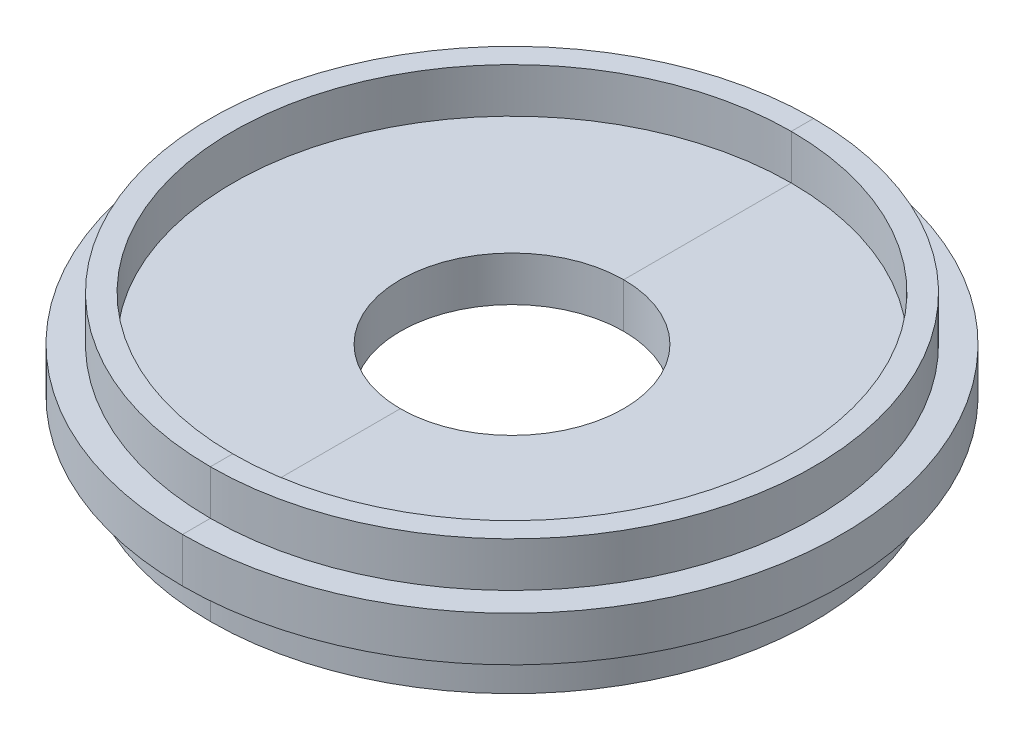
ISO-10303-21;
HEADER;
FILE_DESCRIPTION(('STEP AP214'),'2;1');
FILE_NAME('part.step','',(''),(''),'','','');
FILE_SCHEMA(('AUTOMOTIVE_DESIGN { 1 0 10303 214 1 1 1 1 }'));
ENDSEC;
DATA;
#1=APPLICATION_CONTEXT('core data for automotive mechanical design processes');
#2=APPLICATION_PROTOCOL_DEFINITION('international standard','automotive_design',2000,#1);
#3=PRODUCT_CONTEXT('',#1,'mechanical');
#4=PRODUCT('Part','Part','',(#3));
#5=PRODUCT_RELATED_PRODUCT_CATEGORY('part','',(#4));
#6=PRODUCT_DEFINITION_FORMATION('','',#4);
#7=PRODUCT_DEFINITION_CONTEXT('part definition',#1,'design');
#8=PRODUCT_DEFINITION('design','',#6,#7);
#9=PRODUCT_DEFINITION_SHAPE('','',#8);
#10=(LENGTH_UNIT() NAMED_UNIT(*) SI_UNIT(.MILLI.,.METRE.));
#11=(NAMED_UNIT(*) PLANE_ANGLE_UNIT() SI_UNIT($,.RADIAN.));
#12=(NAMED_UNIT(*) SI_UNIT($,.STERADIAN.) SOLID_ANGLE_UNIT());
#13=UNCERTAINTY_MEASURE_WITH_UNIT(LENGTH_MEASURE(1.E-05),#10,'distance_accuracy_value','');
#14=(GEOMETRIC_REPRESENTATION_CONTEXT(3) GLOBAL_UNCERTAINTY_ASSIGNED_CONTEXT((#13)) GLOBAL_UNIT_ASSIGNED_CONTEXT((#10,
#11,#12)) REPRESENTATION_CONTEXT('',''));
#15=CARTESIAN_POINT('',(0.,0.,0.));
#16=DIRECTION('',(0.,0.,1.));
#17=DIRECTION('',(1.,0.,0.));
#18=AXIS2_PLACEMENT_3D('',#15,#16,#17);
#19=CARTESIAN_POINT('',(0.,0.,0.));
#20=DIRECTION('',(1.,0.,0.));
#21=DIRECTION('',(0.,0.,-1.));
#22=AXIS2_PLACEMENT_3D('',#19,#20,#21);
#23=PLANE('',#22);
#24=DIRECTION('',(0.,0.,-1.));
#25=VECTOR('',#24,1.);
#26=CARTESIAN_POINT('',(0.,19.05,0.));
#27=LINE('',#26,#25);
#28=CARTESIAN_POINT('',(0.,19.05,-79.375));
#29=VERTEX_POINT('',#28);
#30=CARTESIAN_POINT('',(0.,19.05,-85.725));
#31=VERTEX_POINT('',#30);
#32=EDGE_CURVE('E248',#29,#31,#27,.T.);
#33=ORIENTED_EDGE('',*,*,#32,.F.);
#34=DIRECTION('',(0.,-1.,0.));
#35=VECTOR('',#34,1.);
#36=CARTESIAN_POINT('',(0.,19.05,-79.375));
#37=LINE('',#36,#35);
#38=CARTESIAN_POINT('',(0.,6.35,-79.375));
#39=VERTEX_POINT('',#38);
#40=EDGE_CURVE('E265',#39,#29,#37,.F.);
#41=ORIENTED_EDGE('',*,*,#40,.F.);
#42=DIRECTION('',(0.,0.,-1.));
#43=VECTOR('',#42,1.);
#44=CARTESIAN_POINT('',(0.,6.35,0.));
#45=LINE('',#44,#43);
#46=CARTESIAN_POINT('',(0.,6.35,-31.75));
#47=VERTEX_POINT('',#46);
#48=EDGE_CURVE('E277',#47,#39,#45,.T.);
#49=ORIENTED_EDGE('',*,*,#48,.F.);
#50=DIRECTION('',(0.,-1.,0.));
#51=VECTOR('',#50,1.);
#52=CARTESIAN_POINT('',(0.,6.35,-31.75));
#53=LINE('',#52,#51);
#54=CARTESIAN_POINT('',(0.,-6.35,-31.75));
#55=VERTEX_POINT('',#54);
#56=EDGE_CURVE('E267',#55,#47,#53,.F.);
#57=ORIENTED_EDGE('',*,*,#56,.F.);
#58=DIRECTION('',(0.,0.,-1.));
#59=VECTOR('',#58,1.);
#60=CARTESIAN_POINT('',(0.,-6.35,0.));
#61=LINE('',#60,#59);
#62=CARTESIAN_POINT('',(0.,-6.35,-79.375));
#63=VERTEX_POINT('',#62);
#64=EDGE_CURVE('E224',#55,#63,#61,.T.);
#65=ORIENTED_EDGE('',*,*,#64,.T.);
#66=DIRECTION('',(0.,1.,0.));
#67=VECTOR('',#66,1.);
#68=CARTESIAN_POINT('',(0.,-19.05,-79.375));
#69=LINE('',#68,#67);
#70=CARTESIAN_POINT('',(0.,-19.05,-79.375));
#71=VERTEX_POINT('',#70);
#72=EDGE_CURVE('E165',#63,#71,#69,.F.);
#73=ORIENTED_EDGE('',*,*,#72,.T.);
#74=DIRECTION('',(0.,0.,1.));
#75=VECTOR('',#74,1.);
#76=CARTESIAN_POINT('',(0.,-19.05,0.));
#77=LINE('',#76,#75);
#78=CARTESIAN_POINT('',(0.,-19.05,-85.725));
#79=VERTEX_POINT('',#78);
#80=EDGE_CURVE('E81',#79,#71,#77,.T.);
#81=ORIENTED_EDGE('',*,*,#80,.F.);
#82=DIRECTION('',(0.,1.,0.));
#83=VECTOR('',#82,1.);
#84=CARTESIAN_POINT('',(0.,-19.05,-85.725));
#85=LINE('',#84,#83);
#86=CARTESIAN_POINT('',(0.,-6.35,-85.725));
#87=VERTEX_POINT('',#86);
#88=EDGE_CURVE('E217',#87,#79,#85,.F.);
#89=ORIENTED_EDGE('',*,*,#88,.F.);
#90=DIRECTION('',(0.,0.,-1.));
#91=VECTOR('',#90,1.);
#92=CARTESIAN_POINT('',(0.,-6.35,0.));
#93=LINE('',#92,#91);
#94=CARTESIAN_POINT('',(0.,-6.35,-93.6625));
#95=VERTEX_POINT('',#94);
#96=EDGE_CURVE('E214',#87,#95,#93,.T.);
#97=ORIENTED_EDGE('',*,*,#96,.T.);
#98=DIRECTION('',(0.,-1.,0.));
#99=VECTOR('',#98,1.);
#100=CARTESIAN_POINT('',(0.,6.35,-93.6625));
#101=LINE('',#100,#99);
#102=CARTESIAN_POINT('',(0.,6.35,-93.6625));
#103=VERTEX_POINT('',#102);
#104=EDGE_CURVE('E235',#95,#103,#101,.F.);
#105=ORIENTED_EDGE('',*,*,#104,.T.);
#106=DIRECTION('',(0.,0.,-1.));
#107=VECTOR('',#106,1.);
#108=CARTESIAN_POINT('',(0.,6.35,0.));
#109=LINE('',#108,#107);
#110=CARTESIAN_POINT('',(0.,6.35,-85.725));
#111=VERTEX_POINT('',#110);
#112=EDGE_CURVE('E251',#111,#103,#109,.T.);
#113=ORIENTED_EDGE('',*,*,#112,.F.);
#114=DIRECTION('',(0.,-1.,0.));
#115=VECTOR('',#114,1.);
#116=CARTESIAN_POINT('',(0.,19.05,-85.725));
#117=LINE('',#116,#115);
#118=EDGE_CURVE('E168',#111,#31,#117,.F.);
#119=ORIENTED_EDGE('',*,*,#118,.T.);
#120=EDGE_LOOP('',(#33,#41,#49,#57,#65,#73,#81,#89,#97,#105,#113,#119));
#121=FACE_BOUND('',#120,.T.);
#122=ADVANCED_FACE('F58',(#121),#23,.T.);
#123=CARTESIAN_POINT('',(0.,19.05,85.725));
#124=VERTEX_POINT('',#123);
#125=CARTESIAN_POINT('',(0.,19.05,79.375));
#126=VERTEX_POINT('',#125);
#127=EDGE_CURVE('E261',#124,#126,#27,.T.);
#128=ORIENTED_EDGE('',*,*,#127,.F.);
#129=DIRECTION('',(0.,-1.,0.));
#130=VECTOR('',#129,1.);
#131=CARTESIAN_POINT('',(0.,19.05,85.725));
#132=LINE('',#131,#130);
#133=CARTESIAN_POINT('',(0.,6.35,85.725));
#134=VERTEX_POINT('',#133);
#135=EDGE_CURVE('E239',#124,#134,#132,.T.);
#136=ORIENTED_EDGE('',*,*,#135,.T.);
#137=CARTESIAN_POINT('',(0.,6.35,93.6625));
#138=VERTEX_POINT('',#137);
#139=EDGE_CURVE('E275',#138,#134,#109,.T.);
#140=ORIENTED_EDGE('',*,*,#139,.F.);
#141=DIRECTION('',(0.,-1.,0.));
#142=VECTOR('',#141,1.);
#143=CARTESIAN_POINT('',(0.,6.35,93.6625));
#144=LINE('',#143,#142);
#145=CARTESIAN_POINT('',(0.,-6.35,93.6625));
#146=VERTEX_POINT('',#145);
#147=EDGE_CURVE('E222',#138,#146,#144,.T.);
#148=ORIENTED_EDGE('',*,*,#147,.T.);
#149=CARTESIAN_POINT('',(0.,-6.35,85.725));
#150=VERTEX_POINT('',#149);
#151=EDGE_CURVE('E211',#146,#150,#93,.T.);
#152=ORIENTED_EDGE('',*,*,#151,.T.);
#153=DIRECTION('',(0.,1.,0.));
#154=VECTOR('',#153,1.);
#155=CARTESIAN_POINT('',(0.,-19.05,85.725));
#156=LINE('',#155,#154);
#157=CARTESIAN_POINT('',(0.,-19.05,85.725));
#158=VERTEX_POINT('',#157);
#159=EDGE_CURVE('E157',#158,#150,#156,.T.);
#160=ORIENTED_EDGE('',*,*,#159,.F.);
#161=CARTESIAN_POINT('',(0.,-19.05,79.375));
#162=VERTEX_POINT('',#161);
#163=EDGE_CURVE('E73',#162,#158,#77,.T.);
#164=ORIENTED_EDGE('',*,*,#163,.F.);
#165=DIRECTION('',(0.,1.,0.));
#166=VECTOR('',#165,1.);
#167=CARTESIAN_POINT('',(0.,-19.05,79.375));
#168=LINE('',#167,#166);
#169=CARTESIAN_POINT('',(0.,-6.35,79.375));
#170=VERTEX_POINT('',#169);
#171=EDGE_CURVE('E155',#162,#170,#168,.T.);
#172=ORIENTED_EDGE('',*,*,#171,.T.);
#173=CARTESIAN_POINT('',(0.,-6.35,31.75));
#174=VERTEX_POINT('',#173);
#175=EDGE_CURVE('E229',#170,#174,#61,.T.);
#176=ORIENTED_EDGE('',*,*,#175,.T.);
#177=DIRECTION('',(0.,-1.,0.));
#178=VECTOR('',#177,1.);
#179=CARTESIAN_POINT('',(0.,6.35,31.75));
#180=LINE('',#179,#178);
#181=CARTESIAN_POINT('',(0.,6.35,31.75));
#182=VERTEX_POINT('',#181);
#183=EDGE_CURVE('E272',#182,#174,#180,.T.);
#184=ORIENTED_EDGE('',*,*,#183,.F.);
#185=CARTESIAN_POINT('',(0.,6.35,79.375));
#186=VERTEX_POINT('',#185);
#187=EDGE_CURVE('E278',#186,#182,#45,.T.);
#188=ORIENTED_EDGE('',*,*,#187,.F.);
#189=DIRECTION('',(0.,-1.,0.));
#190=VECTOR('',#189,1.);
#191=CARTESIAN_POINT('',(0.,19.05,79.375));
#192=LINE('',#191,#190);
#193=EDGE_CURVE('E260',#126,#186,#192,.T.);
#194=ORIENTED_EDGE('',*,*,#193,.F.);
#195=EDGE_LOOP('',(#128,#136,#140,#148,#152,#160,#164,#172,#176,#184,#188,#194));
#196=FACE_BOUND('',#195,.T.);
#197=ADVANCED_FACE('F153',(#196),#23,.T.);
#198=CARTESIAN_POINT('',(0.,-6.35,0.));
#199=DIRECTION('',(0.,1.,0.));
#200=DIRECTION('',(0.,0.,1.));
#201=AXIS2_PLACEMENT_3D('',#198,#199,#200);
#202=PLANE('',#201);
#203=ORIENTED_EDGE('',*,*,#175,.F.);
#204=CARTESIAN_POINT('',(0.,-6.35,0.));
#205=DIRECTION('',(0.,1.,0.));
#206=DIRECTION('',(0.,0.,1.));
#207=AXIS2_PLACEMENT_3D('',#204,#205,#206);
#208=CIRCLE('',#207,79.375);
#209=EDGE_CURVE('E160',#63,#170,#208,.T.);
#210=ORIENTED_EDGE('',*,*,#209,.F.);
#211=ORIENTED_EDGE('',*,*,#64,.F.);
#212=CARTESIAN_POINT('',(0.,-6.35,0.));
#213=DIRECTION('',(0.,1.,0.));
#214=DIRECTION('',(0.,0.,1.));
#215=AXIS2_PLACEMENT_3D('',#212,#213,#214);
#216=CIRCLE('',#215,31.75);
#217=EDGE_CURVE('E188',#55,#174,#216,.T.);
#218=ORIENTED_EDGE('',*,*,#217,.T.);
#219=EDGE_LOOP('',(#203,#210,#211,#218));
#220=FACE_BOUND('',#219,.T.);
#221=ADVANCED_FACE('F291',(#220),#202,.F.);
#222=CARTESIAN_POINT('',(0.,6.35,0.));
#223=DIRECTION('',(0.,1.,0.));
#224=DIRECTION('',(0.,0.,1.));
#225=AXIS2_PLACEMENT_3D('',#222,#223,#224);
#226=PLANE('',#225);
#227=CARTESIAN_POINT('',(0.,6.35,0.));
#228=DIRECTION('',(0.,1.,0.));
#229=DIRECTION('',(0.,0.,1.));
#230=AXIS2_PLACEMENT_3D('',#227,#228,#229);
#231=CIRCLE('',#230,79.375);
#232=EDGE_CURVE('E174',#186,#39,#231,.F.);
#233=ORIENTED_EDGE('',*,*,#232,.F.);
#234=ORIENTED_EDGE('',*,*,#187,.T.);
#235=CARTESIAN_POINT('',(0.,6.35,0.));
#236=DIRECTION('',(0.,1.,0.));
#237=DIRECTION('',(0.,0.,1.));
#238=AXIS2_PLACEMENT_3D('',#235,#236,#237);
#239=CIRCLE('',#238,31.75);
#240=EDGE_CURVE('E184',#47,#182,#239,.T.);
#241=ORIENTED_EDGE('',*,*,#240,.F.);
#242=ORIENTED_EDGE('',*,*,#48,.T.);
#243=EDGE_LOOP('',(#233,#234,#241,#242));
#244=FACE_BOUND('',#243,.T.);
#245=ADVANCED_FACE('F295',(#244),#226,.T.);
#246=CARTESIAN_POINT('',(0.,6.35,0.));
#247=DIRECTION('',(0.,1.,0.));
#248=DIRECTION('',(0.,0.,1.));
#249=AXIS2_PLACEMENT_3D('',#246,#247,#248);
#250=CIRCLE('',#249,93.6625);
#251=EDGE_CURVE('E178',#103,#138,#250,.T.);
#252=ORIENTED_EDGE('',*,*,#251,.T.);
#253=ORIENTED_EDGE('',*,*,#139,.T.);
#254=CARTESIAN_POINT('',(0.,6.35,0.));
#255=DIRECTION('',(0.,1.,0.));
#256=DIRECTION('',(0.,0.,1.));
#257=AXIS2_PLACEMENT_3D('',#254,#255,#256);
#258=CIRCLE('',#257,85.725);
#259=EDGE_CURVE('E195',#111,#134,#258,.T.);
#260=ORIENTED_EDGE('',*,*,#259,.F.);
#261=ORIENTED_EDGE('',*,*,#112,.T.);
#262=EDGE_LOOP('',(#252,#253,#260,#261));
#263=FACE_BOUND('',#262,.T.);
#264=ADVANCED_FACE('F305',(#263),#226,.T.);
#265=ORIENTED_EDGE('',*,*,#151,.F.);
#266=CARTESIAN_POINT('',(0.,-6.35,0.));
#267=DIRECTION('',(0.,1.,0.));
#268=DIRECTION('',(0.,0.,1.));
#269=AXIS2_PLACEMENT_3D('',#266,#267,#268);
#270=CIRCLE('',#269,93.6625);
#271=EDGE_CURVE('E181',#95,#146,#270,.T.);
#272=ORIENTED_EDGE('',*,*,#271,.F.);
#273=ORIENTED_EDGE('',*,*,#96,.F.);
#274=CARTESIAN_POINT('',(0.,-6.35,0.));
#275=DIRECTION('',(0.,1.,0.));
#276=DIRECTION('',(0.,0.,1.));
#277=AXIS2_PLACEMENT_3D('',#274,#275,#276);
#278=CIRCLE('',#277,85.725);
#279=EDGE_CURVE('E67',#87,#150,#278,.T.);
#280=ORIENTED_EDGE('',*,*,#279,.T.);
#281=EDGE_LOOP('',(#265,#272,#273,#280));
#282=FACE_BOUND('',#281,.T.);
#283=ADVANCED_FACE('F210',(#282),#202,.F.);
#284=CARTESIAN_POINT('',(0.,6.35,0.));
#285=DIRECTION('',(0.,-1.,0.));
#286=DIRECTION('',(0.,0.,-1.));
#287=AXIS2_PLACEMENT_3D('',#284,#285,#286);
#288=CYLINDRICAL_SURFACE('',#287,93.6625);
#289=ORIENTED_EDGE('',*,*,#147,.F.);
#290=ORIENTED_EDGE('',*,*,#251,.F.);
#291=ORIENTED_EDGE('',*,*,#104,.F.);
#292=ORIENTED_EDGE('',*,*,#271,.T.);
#293=EDGE_LOOP('',(#289,#290,#291,#292));
#294=FACE_BOUND('',#293,.T.);
#295=ADVANCED_FACE('F60',(#294),#288,.T.);
#296=CARTESIAN_POINT('',(0.,6.35,0.));
#297=DIRECTION('',(0.,-1.,0.));
#298=DIRECTION('',(0.,0.,-1.));
#299=AXIS2_PLACEMENT_3D('',#296,#297,#298);
#300=CYLINDRICAL_SURFACE('',#299,31.75);
#301=ORIENTED_EDGE('',*,*,#240,.T.);
#302=ORIENTED_EDGE('',*,*,#183,.T.);
#303=ORIENTED_EDGE('',*,*,#217,.F.);
#304=ORIENTED_EDGE('',*,*,#56,.T.);
#305=EDGE_LOOP('',(#301,#302,#303,#304));
#306=FACE_BOUND('',#305,.T.);
#307=ADVANCED_FACE('F293',(#306),#300,.F.);
#308=CARTESIAN_POINT('',(0.,19.05,0.));
#309=DIRECTION('',(0.,1.,0.));
#310=DIRECTION('',(0.,0.,1.));
#311=AXIS2_PLACEMENT_3D('',#308,#309,#310);
#312=PLANE('',#311);
#313=CARTESIAN_POINT('',(0.,19.05,0.));
#314=DIRECTION('',(0.,1.,0.));
#315=DIRECTION('',(0.,0.,1.));
#316=AXIS2_PLACEMENT_3D('',#313,#314,#315);
#317=CIRCLE('',#316,85.725);
#318=EDGE_CURVE('E192',#31,#124,#317,.T.);
#319=ORIENTED_EDGE('',*,*,#318,.T.);
#320=ORIENTED_EDGE('',*,*,#127,.T.);
#321=CARTESIAN_POINT('',(0.,19.05,0.));
#322=DIRECTION('',(0.,1.,0.));
#323=DIRECTION('',(0.,0.,1.));
#324=AXIS2_PLACEMENT_3D('',#321,#322,#323);
#325=CIRCLE('',#324,79.375);
#326=EDGE_CURVE('E198',#29,#126,#325,.T.);
#327=ORIENTED_EDGE('',*,*,#326,.F.);
#328=ORIENTED_EDGE('',*,*,#32,.T.);
#329=EDGE_LOOP('',(#319,#320,#327,#328));
#330=FACE_BOUND('',#329,.T.);
#331=ADVANCED_FACE('F258',(#330),#312,.T.);
#332=CARTESIAN_POINT('',(0.,19.05,0.));
#333=DIRECTION('',(0.,-1.,0.));
#334=DIRECTION('',(0.,0.,-1.));
#335=AXIS2_PLACEMENT_3D('',#332,#333,#334);
#336=CYLINDRICAL_SURFACE('',#335,85.725);
#337=ORIENTED_EDGE('',*,*,#135,.F.);
#338=ORIENTED_EDGE('',*,*,#318,.F.);
#339=ORIENTED_EDGE('',*,*,#118,.F.);
#340=ORIENTED_EDGE('',*,*,#259,.T.);
#341=EDGE_LOOP('',(#337,#338,#339,#340));
#342=FACE_BOUND('',#341,.T.);
#343=ADVANCED_FACE('F254',(#342),#336,.T.);
#344=CARTESIAN_POINT('',(0.,19.05,0.));
#345=DIRECTION('',(0.,-1.,0.));
#346=DIRECTION('',(0.,0.,-1.));
#347=AXIS2_PLACEMENT_3D('',#344,#345,#346);
#348=CYLINDRICAL_SURFACE('',#347,79.375);
#349=ORIENTED_EDGE('',*,*,#326,.T.);
#350=ORIENTED_EDGE('',*,*,#193,.T.);
#351=ORIENTED_EDGE('',*,*,#232,.T.);
#352=ORIENTED_EDGE('',*,*,#40,.T.);
#353=EDGE_LOOP('',(#349,#350,#351,#352));
#354=FACE_BOUND('',#353,.T.);
#355=ADVANCED_FACE('F297',(#354),#348,.F.);
#356=CARTESIAN_POINT('',(0.,-19.05,0.));
#357=DIRECTION('',(0.,1.,0.));
#358=DIRECTION('',(0.,0.,1.));
#359=AXIS2_PLACEMENT_3D('',#356,#357,#358);
#360=CYLINDRICAL_SURFACE('',#359,85.725);
#361=ORIENTED_EDGE('',*,*,#279,.F.);
#362=ORIENTED_EDGE('',*,*,#88,.T.);
#363=CARTESIAN_POINT('',(0.,-19.05,0.));
#364=DIRECTION('',(0.,1.,0.));
#365=DIRECTION('',(0.,0.,1.));
#366=AXIS2_PLACEMENT_3D('',#363,#364,#365);
#367=CIRCLE('',#366,85.725);
#368=EDGE_CURVE('E202',#79,#158,#367,.T.);
#369=ORIENTED_EDGE('',*,*,#368,.T.);
#370=ORIENTED_EDGE('',*,*,#159,.T.);
#371=EDGE_LOOP('',(#361,#362,#369,#370));
#372=FACE_BOUND('',#371,.T.);
#373=ADVANCED_FACE('F216',(#372),#360,.T.);
#374=CARTESIAN_POINT('',(0.,-19.05,0.));
#375=DIRECTION('',(0.,-1.,0.));
#376=DIRECTION('',(0.,0.,1.));
#377=AXIS2_PLACEMENT_3D('',#374,#375,#376);
#378=PLANE('',#377);
#379=ORIENTED_EDGE('',*,*,#368,.F.);
#380=ORIENTED_EDGE('',*,*,#80,.T.);
#381=CARTESIAN_POINT('',(0.,-19.05,0.));
#382=DIRECTION('',(0.,1.,0.));
#383=DIRECTION('',(0.,0.,1.));
#384=AXIS2_PLACEMENT_3D('',#381,#382,#383);
#385=CIRCLE('',#384,79.375);
#386=EDGE_CURVE('E13',#71,#162,#385,.T.);
#387=ORIENTED_EDGE('',*,*,#386,.T.);
#388=ORIENTED_EDGE('',*,*,#163,.T.);
#389=EDGE_LOOP('',(#379,#380,#387,#388));
#390=FACE_BOUND('',#389,.T.);
#391=ADVANCED_FACE('F146',(#390),#378,.T.);
#392=CARTESIAN_POINT('',(0.,-19.05,0.));
#393=DIRECTION('',(0.,1.,0.));
#394=DIRECTION('',(0.,0.,1.));
#395=AXIS2_PLACEMENT_3D('',#392,#393,#394);
#396=CYLINDRICAL_SURFACE('',#395,79.375);
#397=ORIENTED_EDGE('',*,*,#72,.F.);
#398=ORIENTED_EDGE('',*,*,#209,.T.);
#399=ORIENTED_EDGE('',*,*,#171,.F.);
#400=ORIENTED_EDGE('',*,*,#386,.F.);
#401=EDGE_LOOP('',(#397,#398,#399,#400));
#402=FACE_BOUND('',#401,.T.);
#403=ADVANCED_FACE('F162',(#402),#396,.F.);
#404=CLOSED_SHELL('',(#122,#197,#221,#245,#264,#283,#295,#307,#331,#343,#355,#373,#391,#403));
#405=MANIFOLD_SOLID_BREP('B2',#404);
#406=CARTESIAN_POINT('',(0.,0.,0.));
#407=DIRECTION('',(1.,0.,0.));
#408=DIRECTION('',(0.,0.,-1.));
#409=AXIS2_PLACEMENT_3D('',#406,#407,#408);
#410=PLANE('',#409);
#411=DIRECTION('',(0.,0.,-1.));
#412=VECTOR('',#411,1.);
#413=CARTESIAN_POINT('',(0.,19.05,0.));
#414=LINE('',#413,#412);
#415=CARTESIAN_POINT('',(0.,19.05,-79.375));
#416=VERTEX_POINT('',#415);
#417=CARTESIAN_POINT('',(0.,19.05,-85.725));
#418=VERTEX_POINT('',#417);
#419=EDGE_CURVE('E614',#416,#418,#414,.T.);
#420=ORIENTED_EDGE('',*,*,#419,.T.);
#421=DIRECTION('',(0.,-1.,0.));
#422=VECTOR('',#421,1.);
#423=CARTESIAN_POINT('',(0.,19.05,-85.725));
#424=LINE('',#423,#422);
#425=CARTESIAN_POINT('',(0.,6.35,-85.725));
#426=VERTEX_POINT('',#425);
#427=EDGE_CURVE('E452',#426,#418,#424,.F.);
#428=ORIENTED_EDGE('',*,*,#427,.F.);
#429=DIRECTION('',(0.,0.,-1.));
#430=VECTOR('',#429,1.);
#431=CARTESIAN_POINT('',(0.,6.35,0.));
#432=LINE('',#431,#430);
#433=CARTESIAN_POINT('',(0.,6.35,-93.6625));
#434=VERTEX_POINT('',#433);
#435=EDGE_CURVE('E600',#426,#434,#432,.T.);
#436=ORIENTED_EDGE('',*,*,#435,.T.);
#437=DIRECTION('',(0.,-1.,0.));
#438=VECTOR('',#437,1.);
#439=CARTESIAN_POINT('',(0.,6.35,-93.6625));
#440=LINE('',#439,#438);
#441=CARTESIAN_POINT('',(0.,-6.35,-93.6625));
#442=VERTEX_POINT('',#441);
#443=EDGE_CURVE('E603',#442,#434,#440,.F.);
#444=ORIENTED_EDGE('',*,*,#443,.F.);
#445=DIRECTION('',(0.,0.,-1.));
#446=VECTOR('',#445,1.);
#447=CARTESIAN_POINT('',(0.,-6.35,0.));
#448=LINE('',#447,#446);
#449=CARTESIAN_POINT('',(0.,-6.35,-85.725));
#450=VERTEX_POINT('',#449);
#451=EDGE_CURVE('E594',#450,#442,#448,.T.);
#452=ORIENTED_EDGE('',*,*,#451,.F.);
#453=DIRECTION('',(0.,1.,0.));
#454=VECTOR('',#453,1.);
#455=CARTESIAN_POINT('',(0.,-19.05,-85.725));
#456=LINE('',#455,#454);
#457=CARTESIAN_POINT('',(0.,-19.05,-85.725));
#458=VERTEX_POINT('',#457);
#459=EDGE_CURVE('E590',#450,#458,#456,.F.);
#460=ORIENTED_EDGE('',*,*,#459,.T.);
#461=DIRECTION('',(0.,0.,1.));
#462=VECTOR('',#461,1.);
#463=CARTESIAN_POINT('',(0.,-19.05,0.));
#464=LINE('',#463,#462);
#465=CARTESIAN_POINT('',(0.,-19.05,-79.375));
#466=VERTEX_POINT('',#465);
#467=EDGE_CURVE('E457',#458,#466,#464,.T.);
#468=ORIENTED_EDGE('',*,*,#467,.T.);
#469=DIRECTION('',(0.,1.,0.));
#470=VECTOR('',#469,1.);
#471=CARTESIAN_POINT('',(0.,-19.05,-79.375));
#472=LINE('',#471,#470);
#473=CARTESIAN_POINT('',(0.,-6.35,-79.375));
#474=VERTEX_POINT('',#473);
#475=EDGE_CURVE('E552',#474,#466,#472,.F.);
#476=ORIENTED_EDGE('',*,*,#475,.F.);
#477=DIRECTION('',(0.,0.,-1.));
#478=VECTOR('',#477,1.);
#479=CARTESIAN_POINT('',(0.,-6.35,0.));
#480=LINE('',#479,#478);
#481=CARTESIAN_POINT('',(0.,-6.35,-31.75));
#482=VERTEX_POINT('',#481);
#483=EDGE_CURVE('E593',#482,#474,#480,.T.);
#484=ORIENTED_EDGE('',*,*,#483,.F.);
#485=DIRECTION('',(0.,-1.,0.));
#486=VECTOR('',#485,1.);
#487=CARTESIAN_POINT('',(0.,6.35,-31.75));
#488=LINE('',#487,#486);
#489=CARTESIAN_POINT('',(0.,6.35,-31.75));
#490=VERTEX_POINT('',#489);
#491=EDGE_CURVE('E599',#482,#490,#488,.F.);
#492=ORIENTED_EDGE('',*,*,#491,.T.);
#493=DIRECTION('',(0.,0.,-1.));
#494=VECTOR('',#493,1.);
#495=CARTESIAN_POINT('',(0.,6.35,0.));
#496=LINE('',#495,#494);
#497=CARTESIAN_POINT('',(0.,6.35,-79.375));
#498=VERTEX_POINT('',#497);
#499=EDGE_CURVE('E607',#490,#498,#496,.T.);
#500=ORIENTED_EDGE('',*,*,#499,.T.);
#501=DIRECTION('',(0.,-1.,0.));
#502=VECTOR('',#501,1.);
#503=CARTESIAN_POINT('',(0.,19.05,-79.375));
#504=LINE('',#503,#502);
#505=EDGE_CURVE('E613',#498,#416,#504,.F.);
#506=ORIENTED_EDGE('',*,*,#505,.T.);
#507=EDGE_LOOP('',(#420,#428,#436,#444,#452,#460,#468,#476,#484,#492,#500,#506));
#508=FACE_BOUND('',#507,.T.);
#509=ADVANCED_FACE('F448',(#508),#410,.F.);
#510=CARTESIAN_POINT('',(0.,19.05,85.725));
#511=VERTEX_POINT('',#510);
#512=CARTESIAN_POINT('',(0.,19.05,79.375));
#513=VERTEX_POINT('',#512);
#514=EDGE_CURVE('E619',#511,#513,#414,.T.);
#515=ORIENTED_EDGE('',*,*,#514,.T.);
#516=DIRECTION('',(0.,-1.,0.));
#517=VECTOR('',#516,1.);
#518=CARTESIAN_POINT('',(0.,19.05,79.375));
#519=LINE('',#518,#517);
#520=CARTESIAN_POINT('',(0.,6.35,79.375));
#521=VERTEX_POINT('',#520);
#522=EDGE_CURVE('E610',#513,#521,#519,.T.);
#523=ORIENTED_EDGE('',*,*,#522,.T.);
#524=CARTESIAN_POINT('',(0.,6.35,31.75));
#525=VERTEX_POINT('',#524);
#526=EDGE_CURVE('E596',#521,#525,#496,.T.);
#527=ORIENTED_EDGE('',*,*,#526,.T.);
#528=DIRECTION('',(0.,-1.,0.));
#529=VECTOR('',#528,1.);
#530=CARTESIAN_POINT('',(0.,6.35,31.75));
#531=LINE('',#530,#529);
#532=CARTESIAN_POINT('',(0.,-6.35,31.75));
#533=VERTEX_POINT('',#532);
#534=EDGE_CURVE('E597',#525,#533,#531,.T.);
#535=ORIENTED_EDGE('',*,*,#534,.T.);
#536=CARTESIAN_POINT('',(0.,-6.35,79.375));
#537=VERTEX_POINT('',#536);
#538=EDGE_CURVE('E548',#537,#533,#480,.T.);
#539=ORIENTED_EDGE('',*,*,#538,.F.);
#540=DIRECTION('',(0.,1.,0.));
#541=VECTOR('',#540,1.);
#542=CARTESIAN_POINT('',(0.,-19.05,79.375));
#543=LINE('',#542,#541);
#544=CARTESIAN_POINT('',(0.,-19.05,79.375));
#545=VERTEX_POINT('',#544);
#546=EDGE_CURVE('E545',#545,#537,#543,.T.);
#547=ORIENTED_EDGE('',*,*,#546,.F.);
#548=CARTESIAN_POINT('',(0.,-19.05,85.725));
#549=VERTEX_POINT('',#548);
#550=EDGE_CURVE('E56',#545,#549,#464,.T.);
#551=ORIENTED_EDGE('',*,*,#550,.T.);
#552=DIRECTION('',(0.,1.,0.));
#553=VECTOR('',#552,1.);
#554=CARTESIAN_POINT('',(0.,-19.05,85.725));
#555=LINE('',#554,#553);
#556=CARTESIAN_POINT('',(0.,-6.35,85.725));
#557=VERTEX_POINT('',#556);
#558=EDGE_CURVE('E465',#549,#557,#555,.T.);
#559=ORIENTED_EDGE('',*,*,#558,.T.);
#560=CARTESIAN_POINT('',(0.,-6.35,93.6625));
#561=VERTEX_POINT('',#560);
#562=EDGE_CURVE('E591',#561,#557,#448,.T.);
#563=ORIENTED_EDGE('',*,*,#562,.F.);
#564=DIRECTION('',(0.,-1.,0.));
#565=VECTOR('',#564,1.);
#566=CARTESIAN_POINT('',(0.,6.35,93.6625));
#567=LINE('',#566,#565);
#568=CARTESIAN_POINT('',(0.,6.35,93.6625));
#569=VERTEX_POINT('',#568);
#570=EDGE_CURVE('E601',#569,#561,#567,.T.);
#571=ORIENTED_EDGE('',*,*,#570,.F.);
#572=CARTESIAN_POINT('',(0.,6.35,85.725));
#573=VERTEX_POINT('',#572);
#574=EDGE_CURVE('E606',#569,#573,#432,.T.);
#575=ORIENTED_EDGE('',*,*,#574,.T.);
#576=DIRECTION('',(0.,-1.,0.));
#577=VECTOR('',#576,1.);
#578=CARTESIAN_POINT('',(0.,19.05,85.725));
#579=LINE('',#578,#577);
#580=EDGE_CURVE('E615',#511,#573,#579,.T.);
#581=ORIENTED_EDGE('',*,*,#580,.F.);
#582=EDGE_LOOP('',(#515,#523,#527,#535,#539,#547,#551,#559,#563,#571,#575,#581));
#583=FACE_BOUND('',#582,.T.);
#584=ADVANCED_FACE('F450',(#583),#410,.F.);
#585=CARTESIAN_POINT('',(0.,-6.35,0.));
#586=DIRECTION('',(0.,1.,0.));
#587=DIRECTION('',(0.,0.,1.));
#588=AXIS2_PLACEMENT_3D('',#585,#586,#587);
#589=PLANE('',#588);
#590=CARTESIAN_POINT('',(0.,-6.35,0.));
#591=DIRECTION('',(0.,1.,0.));
#592=DIRECTION('',(0.,0.,1.));
#593=AXIS2_PLACEMENT_3D('',#590,#591,#592);
#594=CIRCLE('',#593,93.6625);
#595=EDGE_CURVE('E576',#561,#442,#594,.T.);
#596=ORIENTED_EDGE('',*,*,#595,.F.);
#597=ORIENTED_EDGE('',*,*,#562,.T.);
#598=CARTESIAN_POINT('',(0.,-6.35,0.));
#599=DIRECTION('',(0.,1.,0.));
#600=DIRECTION('',(0.,0.,1.));
#601=AXIS2_PLACEMENT_3D('',#598,#599,#600);
#602=CIRCLE('',#601,85.725);
#603=EDGE_CURVE('E557',#557,#450,#602,.T.);
#604=ORIENTED_EDGE('',*,*,#603,.T.);
#605=ORIENTED_EDGE('',*,*,#451,.T.);
#606=EDGE_LOOP('',(#596,#597,#604,#605));
#607=FACE_BOUND('',#606,.T.);
#608=ADVANCED_FACE('F650',(#607),#589,.F.);
#609=CARTESIAN_POINT('',(0.,-19.05,0.));
#610=DIRECTION('',(0.,1.,0.));
#611=DIRECTION('',(0.,0.,1.));
#612=AXIS2_PLACEMENT_3D('',#609,#610,#611);
#613=CYLINDRICAL_SURFACE('',#612,85.725);
#614=ORIENTED_EDGE('',*,*,#459,.F.);
#615=ORIENTED_EDGE('',*,*,#603,.F.);
#616=ORIENTED_EDGE('',*,*,#558,.F.);
#617=CARTESIAN_POINT('',(0.,-19.05,0.));
#618=DIRECTION('',(0.,1.,0.));
#619=DIRECTION('',(0.,0.,1.));
#620=AXIS2_PLACEMENT_3D('',#617,#618,#619);
#621=CIRCLE('',#620,85.725);
#622=EDGE_CURVE('E542',#549,#458,#621,.T.);
#623=ORIENTED_EDGE('',*,*,#622,.T.);
#624=EDGE_LOOP('',(#614,#615,#616,#623));
#625=FACE_BOUND('',#624,.T.);
#626=ADVANCED_FACE('F651',(#625),#613,.T.);
#627=CARTESIAN_POINT('',(0.,-19.05,0.));
#628=DIRECTION('',(0.,-1.,0.));
#629=DIRECTION('',(0.,0.,1.));
#630=AXIS2_PLACEMENT_3D('',#627,#628,#629);
#631=PLANE('',#630);
#632=ORIENTED_EDGE('',*,*,#467,.F.);
#633=ORIENTED_EDGE('',*,*,#622,.F.);
#634=ORIENTED_EDGE('',*,*,#550,.F.);
#635=CARTESIAN_POINT('',(0.,-19.05,0.));
#636=DIRECTION('',(0.,1.,0.));
#637=DIRECTION('',(0.,0.,1.));
#638=AXIS2_PLACEMENT_3D('',#635,#636,#637);
#639=CIRCLE('',#638,79.375);
#640=EDGE_CURVE('E541',#545,#466,#639,.T.);
#641=ORIENTED_EDGE('',*,*,#640,.T.);
#642=EDGE_LOOP('',(#632,#633,#634,#641));
#643=FACE_BOUND('',#642,.T.);
#644=ADVANCED_FACE('F539',(#643),#631,.T.);
#645=CARTESIAN_POINT('',(0.,-6.35,0.));
#646=DIRECTION('',(0.,1.,0.));
#647=DIRECTION('',(0.,0.,1.));
#648=AXIS2_PLACEMENT_3D('',#645,#646,#647);
#649=CIRCLE('',#648,79.375);
#650=EDGE_CURVE('E553',#537,#474,#649,.T.);
#651=ORIENTED_EDGE('',*,*,#650,.F.);
#652=ORIENTED_EDGE('',*,*,#538,.T.);
#653=CARTESIAN_POINT('',(0.,-6.35,0.));
#654=DIRECTION('',(0.,1.,0.));
#655=DIRECTION('',(0.,0.,1.));
#656=AXIS2_PLACEMENT_3D('',#653,#654,#655);
#657=CIRCLE('',#656,31.75);
#658=EDGE_CURVE('E570',#533,#482,#657,.T.);
#659=ORIENTED_EDGE('',*,*,#658,.T.);
#660=ORIENTED_EDGE('',*,*,#483,.T.);
#661=EDGE_LOOP('',(#651,#652,#659,#660));
#662=FACE_BOUND('',#661,.T.);
#663=ADVANCED_FACE('F658',(#662),#589,.F.);
#664=CARTESIAN_POINT('',(0.,-19.05,0.));
#665=DIRECTION('',(0.,1.,0.));
#666=DIRECTION('',(0.,0.,1.));
#667=AXIS2_PLACEMENT_3D('',#664,#665,#666);
#668=CYLINDRICAL_SURFACE('',#667,79.375);
#669=ORIENTED_EDGE('',*,*,#650,.T.);
#670=ORIENTED_EDGE('',*,*,#475,.T.);
#671=ORIENTED_EDGE('',*,*,#640,.F.);
#672=ORIENTED_EDGE('',*,*,#546,.T.);
#673=EDGE_LOOP('',(#669,#670,#671,#672));
#674=FACE_BOUND('',#673,.T.);
#675=ADVANCED_FACE('F555',(#674),#668,.F.);
#676=CARTESIAN_POINT('',(0.,6.35,0.));
#677=DIRECTION('',(0.,1.,0.));
#678=DIRECTION('',(0.,0.,1.));
#679=AXIS2_PLACEMENT_3D('',#676,#677,#678);
#680=PLANE('',#679);
#681=ORIENTED_EDGE('',*,*,#574,.F.);
#682=CARTESIAN_POINT('',(0.,6.35,0.));
#683=DIRECTION('',(0.,1.,0.));
#684=DIRECTION('',(0.,0.,1.));
#685=AXIS2_PLACEMENT_3D('',#682,#683,#684);
#686=CIRCLE('',#685,93.6625);
#687=EDGE_CURVE('E579',#569,#434,#686,.T.);
#688=ORIENTED_EDGE('',*,*,#687,.T.);
#689=ORIENTED_EDGE('',*,*,#435,.F.);
#690=CARTESIAN_POINT('',(0.,6.35,0.));
#691=DIRECTION('',(0.,1.,0.));
#692=DIRECTION('',(0.,0.,1.));
#693=AXIS2_PLACEMENT_3D('',#690,#691,#692);
#694=CIRCLE('',#693,85.725);
#695=EDGE_CURVE('E566',#573,#426,#694,.T.);
#696=ORIENTED_EDGE('',*,*,#695,.F.);
#697=EDGE_LOOP('',(#681,#688,#689,#696));
#698=FACE_BOUND('',#697,.T.);
#699=ADVANCED_FACE('F643',(#698),#680,.T.);
#700=ORIENTED_EDGE('',*,*,#526,.F.);
#701=CARTESIAN_POINT('',(0.,6.35,0.));
#702=DIRECTION('',(0.,1.,0.));
#703=DIRECTION('',(0.,0.,1.));
#704=AXIS2_PLACEMENT_3D('',#701,#702,#703);
#705=CIRCLE('',#704,79.375);
#706=EDGE_CURVE('E582',#498,#521,#705,.F.);
#707=ORIENTED_EDGE('',*,*,#706,.F.);
#708=ORIENTED_EDGE('',*,*,#499,.F.);
#709=CARTESIAN_POINT('',(0.,6.35,0.));
#710=DIRECTION('',(0.,1.,0.));
#711=DIRECTION('',(0.,0.,1.));
#712=AXIS2_PLACEMENT_3D('',#709,#710,#711);
#713=CIRCLE('',#712,31.75);
#714=EDGE_CURVE('E573',#525,#490,#713,.T.);
#715=ORIENTED_EDGE('',*,*,#714,.F.);
#716=EDGE_LOOP('',(#700,#707,#708,#715));
#717=FACE_BOUND('',#716,.T.);
#718=ADVANCED_FACE('F677',(#717),#680,.T.);
#719=CARTESIAN_POINT('',(0.,19.05,0.));
#720=DIRECTION('',(0.,1.,0.));
#721=DIRECTION('',(0.,0.,1.));
#722=AXIS2_PLACEMENT_3D('',#719,#720,#721);
#723=PLANE('',#722);
#724=ORIENTED_EDGE('',*,*,#514,.F.);
#725=CARTESIAN_POINT('',(0.,19.05,0.));
#726=DIRECTION('',(0.,1.,0.));
#727=DIRECTION('',(0.,0.,1.));
#728=AXIS2_PLACEMENT_3D('',#725,#726,#727);
#729=CIRCLE('',#728,85.725);
#730=EDGE_CURVE('E567',#511,#418,#729,.T.);
#731=ORIENTED_EDGE('',*,*,#730,.T.);
#732=ORIENTED_EDGE('',*,*,#419,.F.);
#733=CARTESIAN_POINT('',(0.,19.05,0.));
#734=DIRECTION('',(0.,1.,0.));
#735=DIRECTION('',(0.,0.,1.));
#736=AXIS2_PLACEMENT_3D('',#733,#734,#735);
#737=CIRCLE('',#736,79.375);
#738=EDGE_CURVE('E562',#513,#416,#737,.T.);
#739=ORIENTED_EDGE('',*,*,#738,.F.);
#740=EDGE_LOOP('',(#724,#731,#732,#739));
#741=FACE_BOUND('',#740,.T.);
#742=ADVANCED_FACE('F631',(#741),#723,.T.);
#743=CARTESIAN_POINT('',(0.,19.05,0.));
#744=DIRECTION('',(0.,-1.,0.));
#745=DIRECTION('',(0.,0.,-1.));
#746=AXIS2_PLACEMENT_3D('',#743,#744,#745);
#747=CYLINDRICAL_SURFACE('',#746,79.375);
#748=ORIENTED_EDGE('',*,*,#522,.F.);
#749=ORIENTED_EDGE('',*,*,#738,.T.);
#750=ORIENTED_EDGE('',*,*,#505,.F.);
#751=ORIENTED_EDGE('',*,*,#706,.T.);
#752=EDGE_LOOP('',(#748,#749,#750,#751));
#753=FACE_BOUND('',#752,.T.);
#754=ADVANCED_FACE('F633',(#753),#747,.F.);
#755=CARTESIAN_POINT('',(0.,19.05,0.));
#756=DIRECTION('',(0.,-1.,0.));
#757=DIRECTION('',(0.,0.,-1.));
#758=AXIS2_PLACEMENT_3D('',#755,#756,#757);
#759=CYLINDRICAL_SURFACE('',#758,85.725);
#760=ORIENTED_EDGE('',*,*,#730,.F.);
#761=ORIENTED_EDGE('',*,*,#580,.T.);
#762=ORIENTED_EDGE('',*,*,#695,.T.);
#763=ORIENTED_EDGE('',*,*,#427,.T.);
#764=EDGE_LOOP('',(#760,#761,#762,#763));
#765=FACE_BOUND('',#764,.T.);
#766=ADVANCED_FACE('F637',(#765),#759,.T.);
#767=CARTESIAN_POINT('',(0.,6.35,0.));
#768=DIRECTION('',(0.,-1.,0.));
#769=DIRECTION('',(0.,0.,-1.));
#770=AXIS2_PLACEMENT_3D('',#767,#768,#769);
#771=CYLINDRICAL_SURFACE('',#770,31.75);
#772=ORIENTED_EDGE('',*,*,#534,.F.);
#773=ORIENTED_EDGE('',*,*,#714,.T.);
#774=ORIENTED_EDGE('',*,*,#491,.F.);
#775=ORIENTED_EDGE('',*,*,#658,.F.);
#776=EDGE_LOOP('',(#772,#773,#774,#775));
#777=FACE_BOUND('',#776,.T.);
#778=ADVANCED_FACE('F669',(#777),#771,.F.);
#779=CARTESIAN_POINT('',(0.,6.35,0.));
#780=DIRECTION('',(0.,-1.,0.));
#781=DIRECTION('',(0.,0.,-1.));
#782=AXIS2_PLACEMENT_3D('',#779,#780,#781);
#783=CYLINDRICAL_SURFACE('',#782,93.6625);
#784=ORIENTED_EDGE('',*,*,#687,.F.);
#785=ORIENTED_EDGE('',*,*,#570,.T.);
#786=ORIENTED_EDGE('',*,*,#595,.T.);
#787=ORIENTED_EDGE('',*,*,#443,.T.);
#788=EDGE_LOOP('',(#784,#785,#786,#787));
#789=FACE_BOUND('',#788,.T.);
#790=ADVANCED_FACE('F646',(#789),#783,.T.);
#791=CLOSED_SHELL('',(#509,#584,#608,#626,#644,#663,#675,#699,#718,#742,#754,#766,#778,#790));
#792=MANIFOLD_SOLID_BREP('B7',#791);
#793=ADVANCED_BREP_SHAPE_REPRESENTATION('',(#18,#405,#792),#14);
#794=SHAPE_DEFINITION_REPRESENTATION(#9,#793);
ENDSEC;
END-ISO-10303-21;
